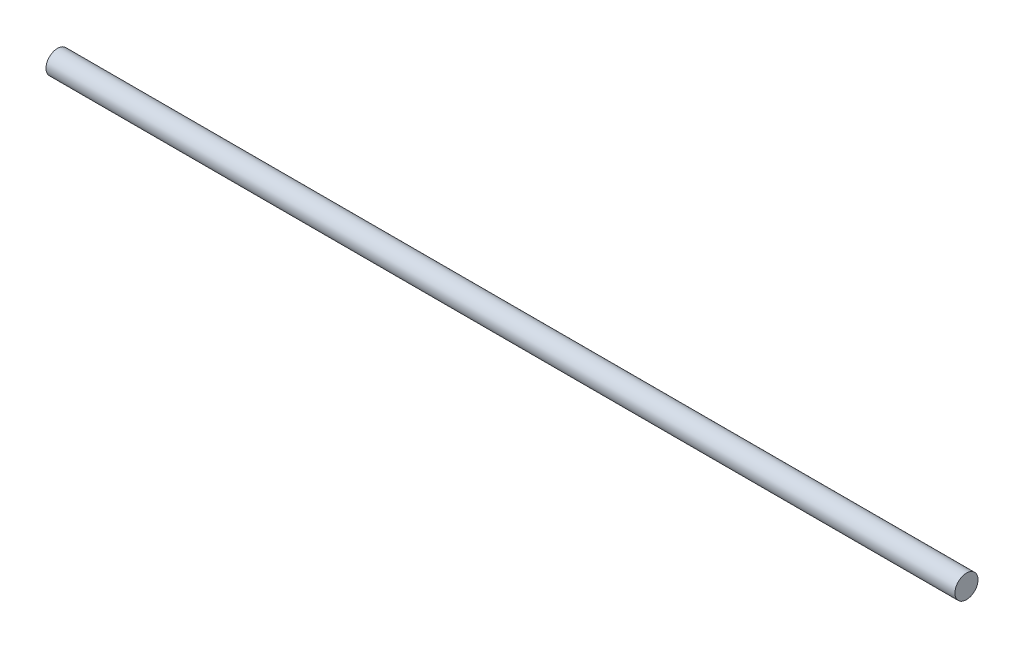
ISO-10303-21;
HEADER;
FILE_DESCRIPTION(('STEP AP214'),'2;1');
FILE_NAME('part.step','',(''),(''),'','','');
FILE_SCHEMA(('AUTOMOTIVE_DESIGN { 1 0 10303 214 1 1 1 1 }'));
ENDSEC;
DATA;
#1=APPLICATION_CONTEXT('core data for automotive mechanical design processes');
#2=APPLICATION_PROTOCOL_DEFINITION('international standard','automotive_design',2000,#1);
#3=PRODUCT_CONTEXT('',#1,'mechanical');
#4=PRODUCT('Part','Part','',(#3));
#5=PRODUCT_RELATED_PRODUCT_CATEGORY('part','',(#4));
#6=PRODUCT_DEFINITION_FORMATION('','',#4);
#7=PRODUCT_DEFINITION_CONTEXT('part definition',#1,'design');
#8=PRODUCT_DEFINITION('design','',#6,#7);
#9=PRODUCT_DEFINITION_SHAPE('','',#8);
#10=(LENGTH_UNIT() NAMED_UNIT(*) SI_UNIT(.MILLI.,.METRE.));
#11=(NAMED_UNIT(*) PLANE_ANGLE_UNIT() SI_UNIT($,.RADIAN.));
#12=(NAMED_UNIT(*) SI_UNIT($,.STERADIAN.) SOLID_ANGLE_UNIT());
#13=UNCERTAINTY_MEASURE_WITH_UNIT(LENGTH_MEASURE(1.E-05),#10,'distance_accuracy_value','');
#14=(GEOMETRIC_REPRESENTATION_CONTEXT(3) GLOBAL_UNCERTAINTY_ASSIGNED_CONTEXT((#13)) GLOBAL_UNIT_ASSIGNED_CONTEXT((#10,
#11,#12)) REPRESENTATION_CONTEXT('',''));
#15=CARTESIAN_POINT('',(0.,0.,0.));
#16=DIRECTION('',(0.,0.,1.));
#17=DIRECTION('',(1.,0.,0.));
#18=AXIS2_PLACEMENT_3D('',#15,#16,#17);
#19=CARTESIAN_POINT('',(1000.,0.,0.));
#20=DIRECTION('',(-1.,0.,0.));
#21=DIRECTION('',(0.,0.,1.));
#22=AXIS2_PLACEMENT_3D('',#19,#20,#21);
#23=CYLINDRICAL_SURFACE('',#22,12.7);
#24=CARTESIAN_POINT('',(1000.,0.,0.));
#25=DIRECTION('',(1.,0.,0.));
#26=DIRECTION('',(0.,0.,-1.));
#27=AXIS2_PLACEMENT_3D('',#24,#25,#26);
#28=CIRCLE('',#27,12.7);
#29=CARTESIAN_POINT('',(1000.,0.,-12.7));
#30=VERTEX_POINT('',#29);
#31=EDGE_CURVE('E10',#30,#30,#28,.T.);
#32=ORIENTED_EDGE('',*,*,#31,.F.);
#33=EDGE_LOOP('',(#32));
#34=FACE_BOUND('',#33,.T.);
#35=CARTESIAN_POINT('',(0.,0.,0.));
#36=DIRECTION('',(1.,0.,0.));
#37=DIRECTION('',(0.,0.,-1.));
#38=AXIS2_PLACEMENT_3D('',#35,#36,#37);
#39=CIRCLE('',#38,12.7);
#40=CARTESIAN_POINT('',(0.,0.,-12.7));
#41=VERTEX_POINT('',#40);
#42=EDGE_CURVE('E44',#41,#41,#39,.T.);
#43=ORIENTED_EDGE('',*,*,#42,.T.);
#44=EDGE_LOOP('',(#43));
#45=FACE_BOUND('',#44,.T.);
#46=ADVANCED_FACE('F41',(#34,#45),#23,.T.);
#47=CARTESIAN_POINT('',(1000.,0.,0.));
#48=DIRECTION('',(1.,0.,0.));
#49=DIRECTION('',(0.,0.,-1.));
#50=AXIS2_PLACEMENT_3D('',#47,#48,#49);
#51=PLANE('',#50);
#52=ORIENTED_EDGE('',*,*,#31,.T.);
#53=EDGE_LOOP('',(#52));
#54=FACE_BOUND('',#53,.T.);
#55=ADVANCED_FACE('F58',(#54),#51,.T.);
#56=CARTESIAN_POINT('',(0.,0.,0.));
#57=DIRECTION('',(1.,0.,0.));
#58=DIRECTION('',(0.,0.,-1.));
#59=AXIS2_PLACEMENT_3D('',#56,#57,#58);
#60=PLANE('',#59);
#61=ORIENTED_EDGE('',*,*,#42,.F.);
#62=EDGE_LOOP('',(#61));
#63=FACE_BOUND('',#62,.T.);
#64=ADVANCED_FACE('F56',(#63),#60,.F.);
#65=CLOSED_SHELL('',(#46,#55,#64));
#66=MANIFOLD_SOLID_BREP('B2',#65);
#67=ADVANCED_BREP_SHAPE_REPRESENTATION('',(#18,#66),#14);
#68=SHAPE_DEFINITION_REPRESENTATION(#9,#67);
ENDSEC;
END-ISO-10303-21;
